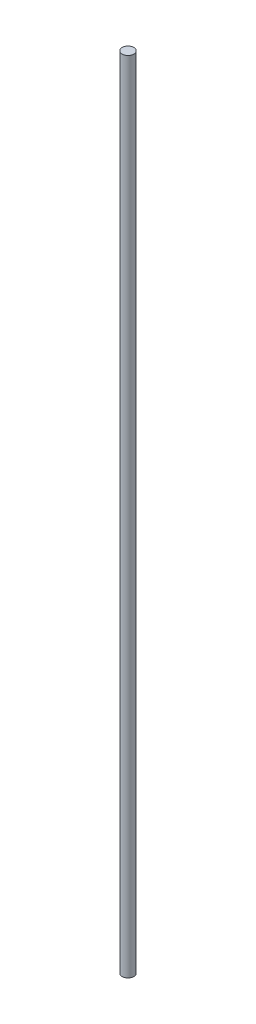
ISO-10303-21;
HEADER;
FILE_DESCRIPTION(('STEP AP214'),'2;1');
FILE_NAME('part.step','',(''),(''),'','','');
FILE_SCHEMA(('AUTOMOTIVE_DESIGN { 1 0 10303 214 1 1 1 1 }'));
ENDSEC;
DATA;
#1=APPLICATION_CONTEXT('core data for automotive mechanical design processes');
#2=APPLICATION_PROTOCOL_DEFINITION('international standard','automotive_design',2000,#1);
#3=PRODUCT_CONTEXT('',#1,'mechanical');
#4=PRODUCT('Part','Part','',(#3));
#5=PRODUCT_RELATED_PRODUCT_CATEGORY('part','',(#4));
#6=PRODUCT_DEFINITION_FORMATION('','',#4);
#7=PRODUCT_DEFINITION_CONTEXT('part definition',#1,'design');
#8=PRODUCT_DEFINITION('design','',#6,#7);
#9=PRODUCT_DEFINITION_SHAPE('','',#8);
#10=(LENGTH_UNIT() NAMED_UNIT(*) SI_UNIT(.MILLI.,.METRE.));
#11=(NAMED_UNIT(*) PLANE_ANGLE_UNIT() SI_UNIT($,.RADIAN.));
#12=(NAMED_UNIT(*) SI_UNIT($,.STERADIAN.) SOLID_ANGLE_UNIT());
#13=UNCERTAINTY_MEASURE_WITH_UNIT(LENGTH_MEASURE(1.E-05),#10,'distance_accuracy_value','');
#14=(GEOMETRIC_REPRESENTATION_CONTEXT(3) GLOBAL_UNCERTAINTY_ASSIGNED_CONTEXT((#13)) GLOBAL_UNIT_ASSIGNED_CONTEXT((#10,
#11,#12)) REPRESENTATION_CONTEXT('',''));
#15=CARTESIAN_POINT('',(0.,0.,0.));
#16=DIRECTION('',(0.,0.,1.));
#17=DIRECTION('',(1.,0.,0.));
#18=AXIS2_PLACEMENT_3D('',#15,#16,#17);
#19=CARTESIAN_POINT('',(0.,550.,0.));
#20=DIRECTION('',(0.,-1.,0.));
#21=DIRECTION('',(0.,0.,-1.));
#22=AXIS2_PLACEMENT_3D('',#19,#20,#21);
#23=CYLINDRICAL_SURFACE('',#22,4.);
#24=CARTESIAN_POINT('',(0.,550.,0.));
#25=DIRECTION('',(0.,1.,0.));
#26=DIRECTION('',(0.,0.,1.));
#27=AXIS2_PLACEMENT_3D('',#24,#25,#26);
#28=CIRCLE('',#27,4.);
#29=CARTESIAN_POINT('',(0.,550.,4.));
#30=VERTEX_POINT('',#29);
#31=EDGE_CURVE('E10',#30,#30,#28,.T.);
#32=ORIENTED_EDGE('',*,*,#31,.F.);
#33=EDGE_LOOP('',(#32));
#34=FACE_BOUND('',#33,.T.);
#35=CARTESIAN_POINT('',(0.,0.,0.));
#36=DIRECTION('',(0.,1.,0.));
#37=DIRECTION('',(0.,0.,1.));
#38=AXIS2_PLACEMENT_3D('',#35,#36,#37);
#39=CIRCLE('',#38,4.);
#40=CARTESIAN_POINT('',(0.,0.,4.));
#41=VERTEX_POINT('',#40);
#42=EDGE_CURVE('E46',#41,#41,#39,.T.);
#43=ORIENTED_EDGE('',*,*,#42,.T.);
#44=EDGE_LOOP('',(#43));
#45=FACE_BOUND('',#44,.T.);
#46=ADVANCED_FACE('F43',(#34,#45),#23,.T.);
#47=CARTESIAN_POINT('',(0.,550.,0.));
#48=DIRECTION('',(0.,1.,0.));
#49=DIRECTION('',(0.,0.,1.));
#50=AXIS2_PLACEMENT_3D('',#47,#48,#49);
#51=PLANE('',#50);
#52=ORIENTED_EDGE('',*,*,#31,.T.);
#53=EDGE_LOOP('',(#52));
#54=FACE_BOUND('',#53,.T.);
#55=ADVANCED_FACE('F60',(#54),#51,.T.);
#56=CARTESIAN_POINT('',(0.,0.,0.));
#57=DIRECTION('',(0.,1.,0.));
#58=DIRECTION('',(0.,0.,1.));
#59=AXIS2_PLACEMENT_3D('',#56,#57,#58);
#60=PLANE('',#59);
#61=ORIENTED_EDGE('',*,*,#42,.F.);
#62=EDGE_LOOP('',(#61));
#63=FACE_BOUND('',#62,.T.);
#64=ADVANCED_FACE('F58',(#63),#60,.F.);
#65=CLOSED_SHELL('',(#46,#55,#64));
#66=MANIFOLD_SOLID_BREP('B2',#65);
#67=ADVANCED_BREP_SHAPE_REPRESENTATION('',(#18,#66),#14);
#68=SHAPE_DEFINITION_REPRESENTATION(#9,#67);
ENDSEC;
END-ISO-10303-21;
